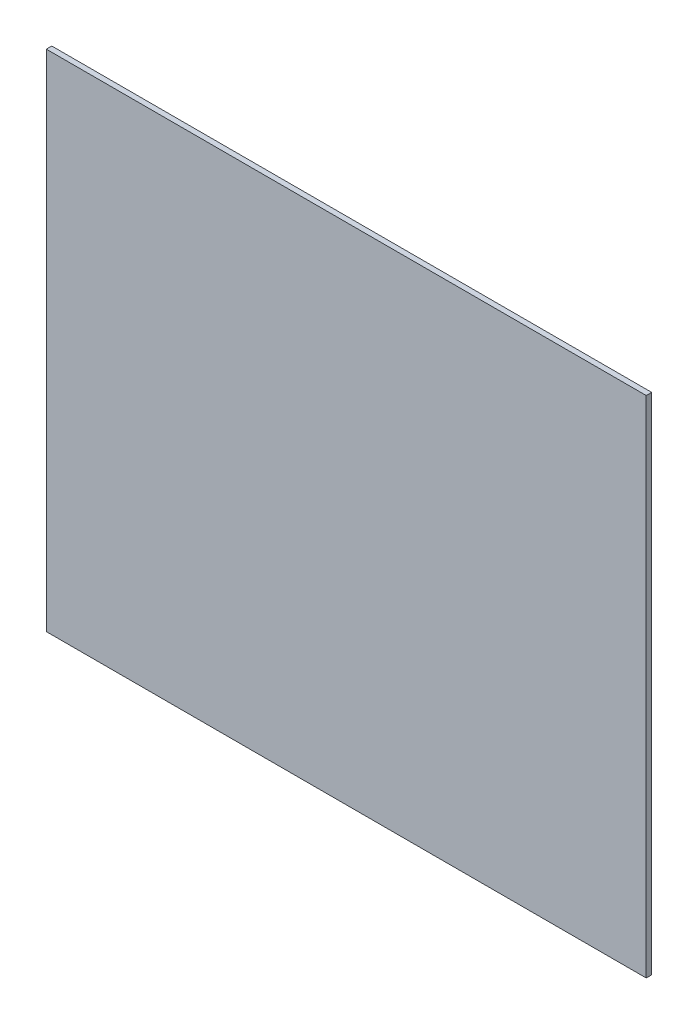
ISO-10303-21;
HEADER;
FILE_DESCRIPTION(('STEP AP214'),'2;1');
FILE_NAME('part.step','',(''),(''),'','','');
FILE_SCHEMA(('AUTOMOTIVE_DESIGN { 1 0 10303 214 1 1 1 1 }'));
ENDSEC;
DATA;
#1=APPLICATION_CONTEXT('core data for automotive mechanical design processes');
#2=APPLICATION_PROTOCOL_DEFINITION('international standard','automotive_design',2000,#1);
#3=PRODUCT_CONTEXT('',#1,'mechanical');
#4=PRODUCT('Part','Part','',(#3));
#5=PRODUCT_RELATED_PRODUCT_CATEGORY('part','',(#4));
#6=PRODUCT_DEFINITION_FORMATION('','',#4);
#7=PRODUCT_DEFINITION_CONTEXT('part definition',#1,'design');
#8=PRODUCT_DEFINITION('design','',#6,#7);
#9=PRODUCT_DEFINITION_SHAPE('','',#8);
#10=(LENGTH_UNIT() NAMED_UNIT(*) SI_UNIT(.MILLI.,.METRE.));
#11=(NAMED_UNIT(*) PLANE_ANGLE_UNIT() SI_UNIT($,.RADIAN.));
#12=(NAMED_UNIT(*) SI_UNIT($,.STERADIAN.) SOLID_ANGLE_UNIT());
#13=UNCERTAINTY_MEASURE_WITH_UNIT(LENGTH_MEASURE(1.E-05),#10,'distance_accuracy_value','');
#14=(GEOMETRIC_REPRESENTATION_CONTEXT(3) GLOBAL_UNCERTAINTY_ASSIGNED_CONTEXT((#13)) GLOBAL_UNIT_ASSIGNED_CONTEXT((#10,
#11,#12)) REPRESENTATION_CONTEXT('',''));
#15=CARTESIAN_POINT('',(0.,0.,0.));
#16=DIRECTION('',(0.,0.,1.));
#17=DIRECTION('',(1.,0.,0.));
#18=AXIS2_PLACEMENT_3D('',#15,#16,#17);
#19=CARTESIAN_POINT('',(0.,40.,0.));
#20=DIRECTION('',(0.,-1.,0.));
#21=DIRECTION('',(0.,0.,-1.));
#22=AXIS2_PLACEMENT_3D('',#19,#20,#21);
#23=PLANE('',#22);
#24=DIRECTION('',(1.,0.,0.));
#25=VECTOR('',#24,1.);
#26=CARTESIAN_POINT('',(0.,40.,0.));
#27=LINE('',#26,#25);
#28=CARTESIAN_POINT('',(110.,40.,0.));
#29=VERTEX_POINT('',#28);
#30=CARTESIAN_POINT('',(-110.,40.,0.));
#31=VERTEX_POINT('',#30);
#32=EDGE_CURVE('E74',#29,#31,#27,.F.);
#33=ORIENTED_EDGE('',*,*,#32,.T.);
#34=DIRECTION('',(0.,0.,1.));
#35=VECTOR('',#34,1.);
#36=CARTESIAN_POINT('',(-110.,40.,0.));
#37=LINE('',#36,#35);
#38=CARTESIAN_POINT('',(-110.,40.,2.));
#39=VERTEX_POINT('',#38);
#40=EDGE_CURVE('E66',#31,#39,#37,.T.);
#41=ORIENTED_EDGE('',*,*,#40,.T.);
#42=DIRECTION('',(1.,0.,0.));
#43=VECTOR('',#42,1.);
#44=CARTESIAN_POINT('',(0.,40.,2.));
#45=LINE('',#44,#43);
#46=CARTESIAN_POINT('',(110.,40.,2.));
#47=VERTEX_POINT('',#46);
#48=EDGE_CURVE('E20',#39,#47,#45,.T.);
#49=ORIENTED_EDGE('',*,*,#48,.T.);
#50=DIRECTION('',(0.,0.,-1.));
#51=VECTOR('',#50,1.);
#52=CARTESIAN_POINT('',(110.,40.,0.));
#53=LINE('',#52,#51);
#54=EDGE_CURVE('E55',#47,#29,#53,.T.);
#55=ORIENTED_EDGE('',*,*,#54,.T.);
#56=EDGE_LOOP('',(#33,#41,#49,#55));
#57=FACE_BOUND('',#56,.T.);
#58=ADVANCED_FACE('F17',(#57),#23,.F.);
#59=CARTESIAN_POINT('',(0.,0.,2.));
#60=DIRECTION('',(0.,0.,1.));
#61=DIRECTION('',(1.,0.,0.));
#62=AXIS2_PLACEMENT_3D('',#59,#60,#61);
#63=PLANE('',#62);
#64=DIRECTION('',(1.,0.,0.));
#65=VECTOR('',#64,1.);
#66=CARTESIAN_POINT('',(0.,-145.,2.));
#67=LINE('',#66,#65);
#68=CARTESIAN_POINT('',(-110.,-145.,2.));
#69=VERTEX_POINT('',#68);
#70=CARTESIAN_POINT('',(110.,-145.,2.));
#71=VERTEX_POINT('',#70);
#72=EDGE_CURVE('E72',#69,#71,#67,.T.);
#73=ORIENTED_EDGE('',*,*,#72,.T.);
#74=DIRECTION('',(0.,1.,0.));
#75=VECTOR('',#74,1.);
#76=CARTESIAN_POINT('',(110.,0.,2.));
#77=LINE('',#76,#75);
#78=EDGE_CURVE('E62',#71,#47,#77,.T.);
#79=ORIENTED_EDGE('',*,*,#78,.T.);
#80=ORIENTED_EDGE('',*,*,#48,.F.);
#81=DIRECTION('',(0.,1.,0.));
#82=VECTOR('',#81,1.);
#83=CARTESIAN_POINT('',(-110.,0.,2.));
#84=LINE('',#83,#82);
#85=EDGE_CURVE('E79',#39,#69,#84,.F.);
#86=ORIENTED_EDGE('',*,*,#85,.T.);
#87=EDGE_LOOP('',(#73,#79,#80,#86));
#88=FACE_BOUND('',#87,.T.);
#89=ADVANCED_FACE('F71',(#88),#63,.T.);
#90=CARTESIAN_POINT('',(110.,0.,0.));
#91=DIRECTION('',(1.,0.,0.));
#92=DIRECTION('',(0.,0.,-1.));
#93=AXIS2_PLACEMENT_3D('',#90,#91,#92);
#94=PLANE('',#93);
#95=DIRECTION('',(0.,0.,1.));
#96=VECTOR('',#95,1.);
#97=CARTESIAN_POINT('',(110.,-145.,0.));
#98=LINE('',#97,#96);
#99=CARTESIAN_POINT('',(110.,-145.,0.));
#100=VERTEX_POINT('',#99);
#101=EDGE_CURVE('E83',#71,#100,#98,.F.);
#102=ORIENTED_EDGE('',*,*,#101,.T.);
#103=DIRECTION('',(0.,1.,0.));
#104=VECTOR('',#103,1.);
#105=CARTESIAN_POINT('',(110.,0.,0.));
#106=LINE('',#105,#104);
#107=EDGE_CURVE('E64',#100,#29,#106,.T.);
#108=ORIENTED_EDGE('',*,*,#107,.T.);
#109=ORIENTED_EDGE('',*,*,#54,.F.);
#110=ORIENTED_EDGE('',*,*,#78,.F.);
#111=EDGE_LOOP('',(#102,#108,#109,#110));
#112=FACE_BOUND('',#111,.T.);
#113=ADVANCED_FACE('F60',(#112),#94,.T.);
#114=CARTESIAN_POINT('',(0.,0.,0.));
#115=DIRECTION('',(0.,0.,1.));
#116=DIRECTION('',(1.,0.,0.));
#117=AXIS2_PLACEMENT_3D('',#114,#115,#116);
#118=PLANE('',#117);
#119=ORIENTED_EDGE('',*,*,#107,.F.);
#120=DIRECTION('',(1.,0.,0.));
#121=VECTOR('',#120,1.);
#122=CARTESIAN_POINT('',(0.,-145.,0.));
#123=LINE('',#122,#121);
#124=CARTESIAN_POINT('',(-110.,-145.,0.));
#125=VERTEX_POINT('',#124);
#126=EDGE_CURVE('E26',#100,#125,#123,.F.);
#127=ORIENTED_EDGE('',*,*,#126,.T.);
#128=DIRECTION('',(0.,1.,0.));
#129=VECTOR('',#128,1.);
#130=CARTESIAN_POINT('',(-110.,0.,0.));
#131=LINE('',#130,#129);
#132=EDGE_CURVE('E34',#125,#31,#131,.T.);
#133=ORIENTED_EDGE('',*,*,#132,.T.);
#134=ORIENTED_EDGE('',*,*,#32,.F.);
#135=EDGE_LOOP('',(#119,#127,#133,#134));
#136=FACE_BOUND('',#135,.T.);
#137=ADVANCED_FACE('F88',(#136),#118,.F.);
#138=CARTESIAN_POINT('',(-110.,0.,0.));
#139=DIRECTION('',(-1.,0.,0.));
#140=DIRECTION('',(0.,0.,1.));
#141=AXIS2_PLACEMENT_3D('',#138,#139,#140);
#142=PLANE('',#141);
#143=DIRECTION('',(0.,0.,1.));
#144=VECTOR('',#143,1.);
#145=CARTESIAN_POINT('',(-110.,-145.,0.));
#146=LINE('',#145,#144);
#147=EDGE_CURVE('E11',#125,#69,#146,.T.);
#148=ORIENTED_EDGE('',*,*,#147,.T.);
#149=ORIENTED_EDGE('',*,*,#85,.F.);
#150=ORIENTED_EDGE('',*,*,#40,.F.);
#151=ORIENTED_EDGE('',*,*,#132,.F.);
#152=EDGE_LOOP('',(#148,#149,#150,#151));
#153=FACE_BOUND('',#152,.T.);
#154=ADVANCED_FACE('F91',(#153),#142,.T.);
#155=CARTESIAN_POINT('',(0.,-145.,0.));
#156=DIRECTION('',(0.,1.,0.));
#157=DIRECTION('',(0.,0.,1.));
#158=AXIS2_PLACEMENT_3D('',#155,#156,#157);
#159=PLANE('',#158);
#160=ORIENTED_EDGE('',*,*,#126,.F.);
#161=ORIENTED_EDGE('',*,*,#101,.F.);
#162=ORIENTED_EDGE('',*,*,#72,.F.);
#163=ORIENTED_EDGE('',*,*,#147,.F.);
#164=EDGE_LOOP('',(#160,#161,#162,#163));
#165=FACE_BOUND('',#164,.T.);
#166=ADVANCED_FACE('F90',(#165),#159,.F.);
#167=CLOSED_SHELL('',(#58,#89,#113,#137,#154,#166));
#168=MANIFOLD_SOLID_BREP('B1',#167);
#169=ADVANCED_BREP_SHAPE_REPRESENTATION('',(#18,#168),#14);
#170=SHAPE_DEFINITION_REPRESENTATION(#9,#169);
ENDSEC;
END-ISO-10303-21;
